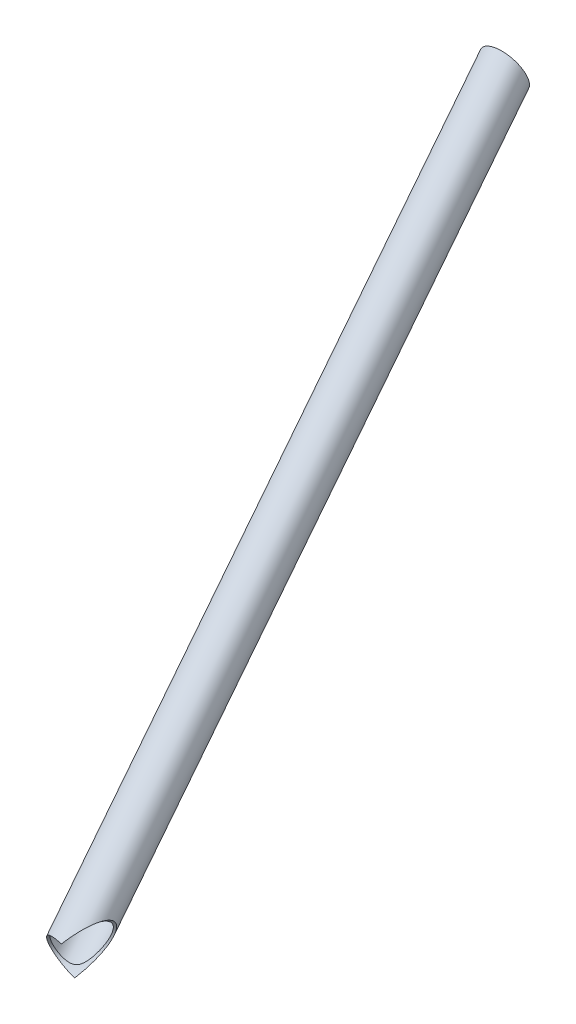
ISO-10303-21;
HEADER;
FILE_DESCRIPTION(('STEP AP214'),'2;1');
FILE_NAME('part.step','',(''),(''),'','','');
FILE_SCHEMA(('AUTOMOTIVE_DESIGN { 1 0 10303 214 1 1 1 1 }'));
ENDSEC;
DATA;
#1=APPLICATION_CONTEXT('core data for automotive mechanical design processes');
#2=APPLICATION_PROTOCOL_DEFINITION('international standard','automotive_design',2000,#1);
#3=PRODUCT_CONTEXT('',#1,'mechanical');
#4=PRODUCT('Part','Part','',(#3));
#5=PRODUCT_RELATED_PRODUCT_CATEGORY('part','',(#4));
#6=PRODUCT_DEFINITION_FORMATION('','',#4);
#7=PRODUCT_DEFINITION_CONTEXT('part definition',#1,'design');
#8=PRODUCT_DEFINITION('design','',#6,#7);
#9=PRODUCT_DEFINITION_SHAPE('','',#8);
#10=(LENGTH_UNIT() NAMED_UNIT(*) SI_UNIT(.MILLI.,.METRE.));
#11=(NAMED_UNIT(*) PLANE_ANGLE_UNIT() SI_UNIT($,.RADIAN.));
#12=(NAMED_UNIT(*) SI_UNIT($,.STERADIAN.) SOLID_ANGLE_UNIT());
#13=UNCERTAINTY_MEASURE_WITH_UNIT(LENGTH_MEASURE(1.E-05),#10,'distance_accuracy_value','');
#14=(GEOMETRIC_REPRESENTATION_CONTEXT(3) GLOBAL_UNCERTAINTY_ASSIGNED_CONTEXT((#13)) GLOBAL_UNIT_ASSIGNED_CONTEXT((#10,
#11,#12)) REPRESENTATION_CONTEXT('',''));
#15=CARTESIAN_POINT('',(0.,0.,0.));
#16=DIRECTION('',(0.,0.,1.));
#17=DIRECTION('',(1.,0.,0.));
#18=AXIS2_PLACEMENT_3D('',#15,#16,#17);
#19=CARTESIAN_POINT('',(80.0000000000001,380.,-601.037933611912));
#20=DIRECTION('',(0.313257210262409,-0.388871019636094,0.866400167535647));
#21=DIRECTION('',(0.,-0.912318699307092,-0.409480879766828));
#22=AXIS2_PLACEMENT_3D('',#19,#20,#21);
#23=CYLINDRICAL_SURFACE('',#22,11.3);
#24=CARTESIAN_POINT('',(80.0000000000001,380.,-601.037933611912));
#25=DIRECTION('',(-0.0877040448988902,0.311824264686693,-0.946083309471727));
#26=DIRECTION('',(0.915766996856784,-0.348518707826595,-0.199763654759287));
#27=AXIS2_PLACEMENT_3D('',#24,#25,#26);
#28=ELLIPSE('',#27,11.6684899557684,11.3);
#29=CARTESIAN_POINT('',(90.6856180046477,375.933312958328,-603.368873810998));
#30=VERTEX_POINT('',#29);
#31=EDGE_CURVE('E81',#30,#30,#28,.T.);
#32=ORIENTED_EDGE('',*,*,#31,.T.);
#33=EDGE_LOOP('',(#32));
#34=FACE_BOUND('',#33,.T.);
#35=CARTESIAN_POINT('',(222.828162374543,192.3868729915,-210.633956516908));
#36=CARTESIAN_POINT('',(222.957115085465,192.469348104641,-210.817715328913));
#37=CARTESIAN_POINT('',(223.079165790472,192.55780120646,-211.003660310366));
#38=CARTESIAN_POINT('',(223.311851727521,192.744301069953,-211.377928118761));
#39=CARTESIAN_POINT('',(223.422479501602,192.842354018944,-211.566252410218));
#40=CARTESIAN_POINT('',(223.634639828135,193.046598409118,-211.944281578601));
#41=CARTESIAN_POINT('',(223.736150399496,193.152808431368,-212.133988659696));
#42=CARTESIAN_POINT('',(223.931531092938,193.371972189239,-212.513342320236));
#43=CARTESIAN_POINT('',(224.025402803244,193.484924514532,-212.70298890405));
#44=CARTESIAN_POINT('',(224.208074460822,193.718229355565,-213.083926226668));
#45=CARTESIAN_POINT('',(224.296797203213,193.838656192305,-213.275208241965));
#46=CARTESIAN_POINT('',(224.4690616336,194.085065562494,-213.656540297822));
#47=CARTESIAN_POINT('',(224.552602799399,194.211048653718,-213.846590212489));
#48=CARTESIAN_POINT('',(224.715302685776,194.468007464896,-214.22477113452));
#49=CARTESIAN_POINT('',(224.794466969055,194.598976472952,-214.412904317574));
#50=CARTESIAN_POINT('',(224.949245790822,194.86581139779,-214.787151159042));
#51=CARTESIAN_POINT('',(225.024860183466,195.001677515359,-214.973264734242));
#52=CARTESIAN_POINT('',(225.220479240454,195.36645873193,-215.46131501484));
#53=CARTESIAN_POINT('',(225.3379808199,195.599365129875,-215.761283745109));
#54=CARTESIAN_POINT('',(225.566872803063,196.077565044939,-216.353618540502));
#55=CARTESIAN_POINT('',(225.678262606299,196.322859774677,-216.645983857113));
#56=CARTESIAN_POINT('',(225.896352843654,196.826217033243,-217.222152753172));
#57=CARTESIAN_POINT('',(226.003046185513,197.084297700232,-217.505943193616));
#58=CARTESIAN_POINT('',(226.212447757731,197.613142273316,-218.062965514165));
#59=CARTESIAN_POINT('',(226.315156251681,197.883905337865,-218.336198092651));
#60=CARTESIAN_POINT('',(226.516072293783,198.43554513086,-218.867387749172));
#61=CARTESIAN_POINT('',(226.614316859343,198.71627831378,-219.125479526924));
#62=CARTESIAN_POINT('',(226.807839957527,199.291258772751,-219.627492140994));
#63=CARTESIAN_POINT('',(226.903117994083,199.585508288868,-219.871410613083));
#64=CARTESIAN_POINT('',(227.090614031368,200.187529510982,-220.341827959793));
#65=CARTESIAN_POINT('',(227.182838108353,200.495271131787,-220.568362773811));
#66=CARTESIAN_POINT('',(227.364312820714,201.125485184233,-221.00106972114));
#67=CARTESIAN_POINT('',(227.453564994347,201.447949783667,-221.207252500749));
#68=CARTESIAN_POINT('',(227.59240102139,201.971260075786,-221.514376695758));
#69=CARTESIAN_POINT('',(227.643076178468,202.167042873658,-221.62348422622));
#70=CARTESIAN_POINT('',(227.743174628546,202.563996443177,-221.832090275745));
#71=CARTESIAN_POINT('',(227.79259795549,202.765167068425,-221.931589055561));
#72=CARTESIAN_POINT('',(227.890093104867,203.173205556742,-222.119804150206));
#73=CARTESIAN_POINT('',(227.938162851778,203.380081298625,-222.208504532946));
#74=CARTESIAN_POINT('',(228.032646786405,203.799157363315,-222.373413030373));
#75=CARTESIAN_POINT('',(228.079060953827,204.011357751338,-222.449620991969));
#76=CARTESIAN_POINT('',(228.170393050868,204.442986634704,-222.588456948029));
#77=CARTESIAN_POINT('',(228.215291019131,204.662466625343,-222.650939299122));
#78=CARTESIAN_POINT('',(228.302695628532,205.10604262979,-222.759237565865));
#79=CARTESIAN_POINT('',(228.345202055775,205.330139054041,-222.805051992769));
#80=CARTESIAN_POINT('',(228.427245507137,205.781548318939,-222.877628333093));
#81=CARTESIAN_POINT('',(228.466787859061,206.008854471164,-222.904425201823));
#82=CARTESIAN_POINT('',(228.542386073738,206.465551910037,-222.936696466794));
#83=CARTESIAN_POINT('',(228.578443403925,206.694942274182,-222.942179875953));
#84=CARTESIAN_POINT('',(228.637207476792,207.091577400588,-222.931315576169));
#85=CARTESIAN_POINT('',(228.660886199806,207.258837639086,-222.920475114301));
#86=CARTESIAN_POINT('',(228.705770072525,207.592294036254,-222.885569932621));
#87=CARTESIAN_POINT('',(228.726975849519,207.75849045462,-222.861508575315));
#88=CARTESIAN_POINT('',(228.76664776383,208.088533197429,-222.799686252957));
#89=CARTESIAN_POINT('',(228.785115902353,208.252381158651,-222.761935365187));
#90=CARTESIAN_POINT('',(228.81910948822,208.576567430454,-222.672531581539));
#91=CARTESIAN_POINT('',(228.834634876882,208.736905670988,-222.62087840848));
#92=CARTESIAN_POINT('',(228.862611504255,209.053186102054,-222.503665097216));
#93=CARTESIAN_POINT('',(228.875054452245,209.209115458565,-222.438068316281));
#94=CARTESIAN_POINT('',(228.89671501867,209.514905953239,-222.293568785907));
#95=CARTESIAN_POINT('',(228.905932702196,209.664767213812,-222.214666305044));
#96=CARTESIAN_POINT('',(228.921129512852,209.957467002677,-222.044348202895));
#97=CARTESIAN_POINT('',(228.927106975646,210.100301887693,-221.952926181096));
#98=CARTESIAN_POINT('',(228.935876407262,210.378104460403,-221.758672752903));
#99=CARTESIAN_POINT('',(228.938667738316,210.513070567872,-221.655839066751));
#100=CARTESIAN_POINT('',(228.941434436757,210.800730338726,-221.41842388673));
#101=CARTESIAN_POINT('',(228.940736542838,210.951585462416,-221.281602412266));
#102=CARTESIAN_POINT('',(228.935222841981,211.240824965297,-220.99550552432));
#103=CARTESIAN_POINT('',(228.930406217106,211.379206861403,-220.846227642441));
#104=CARTESIAN_POINT('',(228.910266265929,211.776075769126,-220.382409693174));
#105=CARTESIAN_POINT('',(228.889251564301,212.016050804719,-220.052085509899));
#106=CARTESIAN_POINT('',(228.841467424049,212.397226190426,-219.447758647526));
#107=CARTESIAN_POINT('',(228.817327425277,212.548269442899,-219.179510887787));
#108=CARTESIAN_POINT('',(228.7629591429,212.826698702412,-218.631426019279));
#109=CARTESIAN_POINT('',(228.732727537127,212.954071727286,-218.351582653078));
#110=CARTESIAN_POINT('',(228.666978381912,213.187622142934,-217.783483544548));
#111=CARTESIAN_POINT('',(228.631454069618,213.293772002965,-217.495217424368));
#112=CARTESIAN_POINT('',(228.555776277607,213.487045129162,-216.912903936573));
#113=CARTESIAN_POINT('',(228.515621097828,213.574161373607,-216.618854478876));
#114=CARTESIAN_POINT('',(228.435234650602,213.723785120244,-216.055354633196));
#115=CARTESIAN_POINT('',(228.395382388081,213.787853843382,-215.786259371189));
#116=CARTESIAN_POINT('',(228.31255561616,213.903368525935,-215.245914886202));
#117=CARTESIAN_POINT('',(228.269581625524,213.954816576444,-214.974666027746));
#118=CARTESIAN_POINT('',(228.180643785828,214.046277203228,-214.430511412922));
#119=CARTESIAN_POINT('',(228.134677479818,214.086280232994,-214.157604466139));
#120=CARTESIAN_POINT('',(228.039883931099,214.155775324659,-213.610938621318));
#121=CARTESIAN_POINT('',(227.991056354418,214.185266156703,-213.337179627373));
#122=CARTESIAN_POINT('',(227.839967985195,214.25946197845,-212.51326998126));
#123=CARTESIAN_POINT('',(227.733438132036,214.289558247075,-211.962548781535));
#124=CARTESIAN_POINT('',(227.508675784083,214.316467769021,-210.863107615511));
#125=CARTESIAN_POINT('',(227.390449358197,214.313298193938,-210.314386762968));
#126=CARTESIAN_POINT('',(227.195895430958,214.285748216704,-209.463215066435));
#127=CARTESIAN_POINT('',(227.124203855783,214.271384452657,-209.159334709659));
#128=CARTESIAN_POINT('',(226.976121341431,214.234224191724,-208.55322122597));
#129=CARTESIAN_POINT('',(226.899730269726,214.211427456932,-208.250988145773));
#130=CARTESIAN_POINT('',(226.741467379053,214.157892343226,-207.648276370183));
#131=CARTESIAN_POINT('',(226.659589059488,214.127144416985,-207.347800231057));
#132=CARTESIAN_POINT('',(226.489474071624,214.05817614594,-206.749525866463));
#133=CARTESIAN_POINT('',(226.401237709518,214.019956160829,-206.451727512811));
#134=CARTESIAN_POINT('',(226.21746205907,213.936614378683,-205.860727370732));
#135=CARTESIAN_POINT('',(226.12195441401,213.891521717519,-205.567511684088));
#136=CARTESIAN_POINT('',(225.921500878887,213.794654468503,-204.985341550358));
#137=CARTESIAN_POINT('',(225.816552963655,213.742878445864,-204.696388033163));
#138=CARTESIAN_POINT('',(225.594986636643,213.633067249416,-204.124859363375));
#139=CARTESIAN_POINT('',(225.478392407054,213.57504502639,-203.842272428241));
#140=CARTESIAN_POINT('',(225.230039873068,213.452945479366,-203.285256186545));
#141=CARTESIAN_POINT('',(225.098290431618,213.388871698275,-203.010822229005));
#142=CARTESIAN_POINT('',(224.857051642309,213.274748811377,-202.553336574914));
#143=CARTESIAN_POINT('',(224.752537362484,213.226171168683,-202.367306944988));
#144=CARTESIAN_POINT('',(224.531795901709,213.126190585119,-202.002989643803));
#145=CARTESIAN_POINT('',(224.415566669266,213.074787150122,-201.824703336382));
#146=CARTESIAN_POINT('',(224.170049738163,212.969523939696,-201.479495396576));
#147=CARTESIAN_POINT('',(224.040832490761,212.915678202373,-201.312519886216));
#148=CARTESIAN_POINT('',(223.767155920065,212.805402113939,-200.992473801607));
#149=CARTESIAN_POINT('',(223.622706046546,212.748973377383,-200.839394714937));
#150=CARTESIAN_POINT('',(223.361690804148,212.650222788303,-200.59261216782));
#151=CARTESIAN_POINT('',(223.249058899831,212.608512909695,-200.494496651084));
#152=CARTESIAN_POINT('',(223.015913235714,212.523845471911,-200.308751256822));
#153=CARTESIAN_POINT('',(222.89540182943,212.480888287402,-200.221118270215));
#154=CARTESIAN_POINT('',(222.647151220518,212.393696947322,-200.05744183412));
#155=CARTESIAN_POINT('',(222.519410996207,212.34946261168,-199.981400028508));
#156=CARTESIAN_POINT('',(222.2578374084,212.259648010314,-199.841571107846));
#157=CARTESIAN_POINT('',(222.124003663866,212.214067660484,-199.777784760455));
#158=CARTESIAN_POINT('',(221.852301151062,212.121650145601,-199.662831055019));
#159=CARTESIAN_POINT('',(221.714455049264,212.074820131861,-199.611604111197));
#160=CARTESIAN_POINT('',(221.43553000543,211.979493797339,-199.520926158217));
#161=CARTESIAN_POINT('',(221.294451010229,211.930997449147,-199.48147534287));
#162=CARTESIAN_POINT('',(221.010128886044,211.832012980756,-199.413482320394));
#163=CARTESIAN_POINT('',(220.866882589301,211.781521726611,-199.384958096683));
#164=CARTESIAN_POINT('',(220.579523874214,211.678348060864,-199.337896585219));
#165=CARTESIAN_POINT('',(220.435411195091,211.62566495803,-199.319362474101));
#166=CARTESIAN_POINT('',(220.045902144728,211.479923250535,-199.281332048896));
#167=CARTESIAN_POINT('',(219.800536215081,211.384520820705,-199.270321777919));
#168=CARTESIAN_POINT('',(219.313141686863,211.18538297168,-199.269351176061));
#169=CARTESIAN_POINT('',(219.071115416057,211.081642053387,-199.279404847873));
#170=CARTESIAN_POINT('',(218.592198705662,210.864719314619,-199.316639501949));
#171=CARTESIAN_POINT('',(218.35531812123,210.751521098927,-199.343850786573));
#172=CARTESIAN_POINT('',(217.888764146317,210.515160909383,-199.412321727021));
#173=CARTESIAN_POINT('',(217.659089347964,210.392000898913,-199.453578619699));
#174=CARTESIAN_POINT('',(217.194564580606,210.127455345888,-199.550592030785));
#175=CARTESIAN_POINT('',(216.960236683502,209.985418772198,-199.607072446696));
#176=CARTESIAN_POINT('',(216.502388725735,209.68919480096,-199.730936551511));
#177=CARTESIAN_POINT('',(216.278869129917,209.535006881554,-199.798320708825));
#178=CARTESIAN_POINT('',(215.844032748469,209.214409404144,-199.942215191488));
#179=CARTESIAN_POINT('',(215.632709914995,209.048005997903,-200.018720935127));
#180=CARTESIAN_POINT('',(215.223414672442,208.702956959346,-200.179456315883));
#181=CARTESIAN_POINT('',(215.025442666181,208.524310957978,-200.263686185869));
#182=CARTESIAN_POINT('',(214.60519082701,208.117296209456,-200.45650996467));
#183=CARTESIAN_POINT('',(214.386189821457,207.886218070502,-200.56656903596));
#184=CARTESIAN_POINT('',(213.971557547005,207.407351782371,-200.794252481235));
#185=CARTESIAN_POINT('',(213.77592939128,207.159561414052,-200.911877859821));
#186=CARTESIAN_POINT('',(213.410173765544,206.648388820891,-201.153003492048));
#187=CARTESIAN_POINT('',(213.240051134273,206.385003650694,-201.276504854601));
#188=CARTESIAN_POINT('',(212.927389752974,205.844256962171,-201.527734802786));
#189=CARTESIAN_POINT('',(212.784848115303,205.566896910808,-201.655462944244));
#190=CARTESIAN_POINT('',(212.537255302474,205.018134844474,-201.905396329635));
#191=CARTESIAN_POINT('',(212.430398861319,204.747471951603,-202.027437584844));
#192=CARTESIAN_POINT('',(212.243677316163,204.197468071203,-202.272628337511));
#193=CARTESIAN_POINT('',(212.163811340054,203.918127364389,-202.395777799029));
#194=CARTESIAN_POINT('',(212.03203499395,203.353023716534,-202.64193716179));
#195=CARTESIAN_POINT('',(211.980111786946,203.067263787472,-202.764947101167));
#196=CARTESIAN_POINT('',(211.904747599718,202.491509536337,-203.009763471039));
#197=CARTESIAN_POINT('',(211.881305280431,202.201515413988,-203.131569957849));
#198=CARTESIAN_POINT('',(211.863713770437,201.639568656813,-203.36472500218));
#199=CARTESIAN_POINT('',(211.867676303682,201.367734029621,-203.476220352349));
#200=CARTESIAN_POINT('',(211.900346505942,200.824493484704,-203.696558172516));
#201=CARTESIAN_POINT('',(211.929052816826,200.55308754427,-203.805400787781));
#202=CARTESIAN_POINT('',(212.010781727579,200.012692623603,-204.019824850659));
#203=CARTESIAN_POINT('',(212.063802574909,199.743703470599,-204.125406532729));
#204=CARTESIAN_POINT('',(212.193482615415,199.210029417325,-204.332854923992));
#205=CARTESIAN_POINT('',(212.270142332948,198.94534461267,-204.434721550721));
#206=CARTESIAN_POINT('',(212.446688007463,198.420677569835,-204.634972641106));
#207=CARTESIAN_POINT('',(212.546698325526,198.160728841101,-204.733335089985));
#208=CARTESIAN_POINT('',(212.768633097341,197.648763526946,-204.925848428207));
#209=CARTESIAN_POINT('',(212.890557550935,197.396746941468,-205.01999931758));
#210=CARTESIAN_POINT('',(213.155156495421,196.902181713327,-205.204170415208));
#211=CARTESIAN_POINT('',(213.297837432451,196.659636041743,-205.29418932877));
#212=CARTESIAN_POINT('',(213.60263108388,196.18560312065,-205.470331900742));
#213=CARTESIAN_POINT('',(213.764744282788,195.954116147071,-205.556455461954));
#214=CARTESIAN_POINT('',(214.119292550475,195.487546830643,-205.731345441645));
#215=CARTESIAN_POINT('',(214.313065983173,195.253387187902,-205.819861735684));
#216=CARTESIAN_POINT('',(214.719736453618,194.801111161517,-205.994015132273));
#217=CARTESIAN_POINT('',(214.932636080813,194.582996957518,-206.0796518428));
#218=CARTESIAN_POINT('',(215.375934495602,194.164548074818,-206.24957062089));
#219=CARTESIAN_POINT('',(215.606341114456,193.964221440812,-206.333852061542));
#220=CARTESIAN_POINT('',(216.082770121012,193.583507739662,-206.503158614663));
#221=CARTESIAN_POINT('',(216.328788368005,193.403115419803,-206.588183524824));
#222=CARTESIAN_POINT('',(216.768279468552,193.109016165019,-206.739317251732));
#223=CARTESIAN_POINT('',(216.958655053912,192.990211945718,-206.804553528916));
#224=CARTESIAN_POINT('',(217.34592703238,192.766039276934,-206.938819897079));
#225=CARTESIAN_POINT('',(217.54282367156,192.660671335198,-207.007850131287));
#226=CARTESIAN_POINT('',(217.941555526437,192.465101309238,-207.151686956949));
#227=CARTESIAN_POINT('',(218.143381953695,192.374874213359,-207.226483718072));
#228=CARTESIAN_POINT('',(218.550551262201,192.211315337256,-207.384530885314));
#229=CARTESIAN_POINT('',(218.755892639311,192.137976515134,-207.467777747061));
#230=CARTESIAN_POINT('',(219.105281401356,192.029746763649,-207.618751607135));
#231=CARTESIAN_POINT('',(219.249072607092,191.989937022514,-207.683551552996));
#232=CARTESIAN_POINT('',(219.535980014819,191.920441535628,-207.819701936611));
#233=CARTESIAN_POINT('',(219.679096432234,191.890752307741,-207.891050110587));
#234=CARTESIAN_POINT('',(219.962996874193,191.842274234534,-208.041028955079));
#235=CARTESIAN_POINT('',(220.103785077559,191.823463175221,-208.11964440157));
#236=CARTESIAN_POINT('',(220.381719497291,191.797174575359,-208.284839144119));
#237=CARTESIAN_POINT('',(220.518865943899,191.789696316633,-208.371417935159));
#238=CARTESIAN_POINT('',(220.788732730518,191.786220006486,-208.553208270601));
#239=CARTESIAN_POINT('',(220.921419980407,191.790294129766,-208.648470473367));
#240=CARTESIAN_POINT('',(221.180022294998,191.809757914638,-208.84671913367));
#241=CARTESIAN_POINT('',(221.305936993581,191.825148187314,-208.949706008077));
#242=CARTESIAN_POINT('',(221.550182964906,191.866489016775,-209.162638107929));
#243=CARTESIAN_POINT('',(221.66850357238,191.892454064854,-209.272592706396));
#244=CARTESIAN_POINT('',(221.896963757726,191.953832021735,-209.498137829612));
#245=CARTESIAN_POINT('',(222.007103830182,191.989244358771,-209.613728012941));
#246=CARTESIAN_POINT('',(222.244013302867,192.077477694402,-209.876719054974));
#247=CARTESIAN_POINT('',(222.368706180599,192.132431647482,-210.025274444944));
#248=CARTESIAN_POINT('',(222.547175589492,192.222504219857,-210.251410778554));
#249=CARTESIAN_POINT('',(222.605187063916,192.253769381294,-210.327267976857));
#250=CARTESIAN_POINT('',(222.718592551762,192.318628987427,-210.479940336338));
#251=CARTESIAN_POINT('',(222.773986572244,192.35222342584,-210.55675549493));
#252=CARTESIAN_POINT('',(222.828162374543,192.3868729915,-210.633956516908));
#253=B_SPLINE_CURVE_WITH_KNOTS('',3,(#35,#36,#37,#38,#39,#40,#41,#42,#43,#44,#45,#46,#47,#48,
#49,#50,#51,#52,#53,#54,#55,#56,#57,#58,#59,#60,#61,#62,#63,#64,#65,#66,#67,#68,#69,#70,#71,#72,
#73,#74,#75,#76,#77,#78,#79,#80,#81,#82,#83,#84,#85,#86,#87,#88,#89,#90,#91,#92,#93,#94,#95,#96,
#97,#98,#99,#100,#101,#102,#103,#104,#105,#106,#107,#108,#109,#110,#111,#112,#113,#114,#115,
#116,#117,#118,#119,#120,#121,#122,#123,#124,#125,#126,#127,#128,#129,#130,#131,#132,#133,#134,
#135,#136,#137,#138,#139,#140,#141,#142,#143,#144,#145,#146,#147,#148,#149,#150,#151,#152,#153,
#154,#155,#156,#157,#158,#159,#160,#161,#162,#163,#164,#165,#166,#167,#168,#169,#170,#171,#172,
#173,#174,#175,#176,#177,#178,#179,#180,#181,#182,#183,#184,#185,#186,#187,#188,#189,#190,#191,
#192,#193,#194,#195,#196,#197,#198,#199,#200,#201,#202,#203,#204,#205,#206,#207,#208,#209,#210,
#211,#212,#213,#214,#215,#216,#217,#218,#219,#220,#221,#222,#223,#224,#225,#226,#227,#228,#229,
#230,#231,#232,#233,#234,#235,#236,#237,#238,#239,#240,#241,#242,#243,#244,#245,#246,#247,#248,
#249,#250,#251,#252),.UNSPECIFIED.,.T.,.F.,(4,2,2,2,2,2,2,2,2,2,2,2,2,2,2,2,2,2,2,2,2,2,2,2,2,2,
2,2,2,2,2,2,2,2,2,2,2,2,2,2,2,2,2,2,2,2,2,2,2,2,2,2,2,2,2,2,2,2,2,2,2,2,2,2,2,2,2,2,2,2,2,2,2,2,
2,2,2,2,2,2,2,2,2,2,2,2,2,2,2,2,2,2,2,2,2,2,2,2,2,2,2,2,2,2,2,2,2,2,4),(0.,0.717419264570185,
1.43530400477421,2.15487550371246,2.87429700958335,3.60262780010119,4.33103187239829,
5.05848784619075,5.7859736806243,6.97823277318627,8.17060879594598,9.36472767099925,
10.5587674217808,11.7397074587129,12.9208439244434,14.0994687307997,15.2774736857481,
15.9666204965787,16.6557486007641,17.3458814378181,18.0360227316773,18.7331669326311,
19.430373385872,20.1262949931001,20.8219222807473,21.3292661504084,21.8364810455539,
22.3433233197633,22.8501757000607,23.3583768907388,23.8665678245872,24.3750195435863,
24.8835730216625,25.4936322059838,26.103812569751,27.3250881640451,28.2503484015392,
29.1761146188562,30.1030740601545,31.030374892273,31.8684608759167,32.706407904976,
33.5450518573164,34.3837938931096,36.0676089678524,37.750554911793,38.6880808194476,
39.6256331781452,40.56431656503,41.5029547763376,42.4377190813621,43.3726843967627,
44.3057472032325,45.2382670913513,45.8944151169727,46.5506782458504,47.2035562123391,
47.8560315132522,48.3207951731646,48.7854206421896,49.2501119438186,49.7148323434269,
50.1773033374501,50.6397819423311,51.1030184755915,51.56640222108,52.3555954609523,
53.1453134998697,53.9364301953403,54.7273913468608,55.5660129012526,56.4046704912342,
57.2429085900752,58.0811719686962,59.0904235718089,60.0998094538652,61.1093865883124,
62.1188579659581,63.0642599176207,64.0096313187568,64.9545680413425,65.8994603349225,
66.7799283348253,67.6603480108776,68.5407042381656,69.4210799949223,70.306255964489,
71.1914319276638,72.0768833804256,72.9623569149985,73.9110321610716,74.8598360400372,
75.8090668670379,76.7580469711146,77.4586867881201,78.1593530739351,78.8588502623415,
79.5580552513826,80.0456664161154,80.5331096400704,81.0195539229528,81.5059673778176,
81.99542643439,82.484911924212,82.9750704565718,83.4651993304078,84.0691282870682,
84.3705323351537,84.6719355702276),.UNSPECIFIED.);
#254=CARTESIAN_POINT('',(222.828162374543,192.3868729915,-210.633956516908));
#255=VERTEX_POINT('',#254);
#256=EDGE_CURVE('E46',#255,#255,#253,.T.);
#257=ORIENTED_EDGE('',*,*,#256,.T.);
#258=EDGE_LOOP('',(#257));
#259=FACE_BOUND('',#258,.T.);
#260=ADVANCED_FACE('F41',(#34,#259),#23,.F.);
#261=CARTESIAN_POINT('',(80.0000000000001,380.,-601.037933611912));
#262=DIRECTION('',(0.313257210262409,-0.388871019636094,0.866400167535647));
#263=DIRECTION('',(0.,-0.912318699307092,-0.409480879766828));
#264=AXIS2_PLACEMENT_3D('',#261,#262,#263);
#265=CYLINDRICAL_SURFACE('',#264,12.5);
#266=CARTESIAN_POINT('',(80.0000000000001,380.,-601.037933611912));
#267=DIRECTION('',(-0.0877040448988902,0.311824264686693,-0.946083309471727));
#268=DIRECTION('',(0.915766996856784,-0.348518707826595,-0.199763654759287));
#269=AXIS2_PLACEMENT_3D('',#266,#267,#268);
#270=ELLIPSE('',#269,12.9076216324872,12.5);
#271=CARTESIAN_POINT('',(91.8203738989466,375.501452387531,-603.616407283468));
#272=VERTEX_POINT('',#271);
#273=EDGE_CURVE('E63',#272,#272,#270,.T.);
#274=ORIENTED_EDGE('',*,*,#273,.F.);
#275=EDGE_LOOP('',(#274));
#276=FACE_BOUND('',#275,.T.);
#277=CARTESIAN_POINT('',(225.,200.,-200.));
#278=DIRECTION('',(0.979997411230481,-0.1383871597552,0.143017719169493));
#279=DIRECTION('',(-0.18494238420669,-0.367901037751926,0.911287627999525));
#280=AXIS2_PLACEMENT_3D('',#277,#278,#279);
#281=ELLIPSE('',#280,25.7882654286992,12.5);
#282=CARTESIAN_POINT('',(224.081323259256,188.506130571339,-204.826696448183));
#283=VERTEX_POINT('',#282);
#284=CARTESIAN_POINT('',(225.918676740744,211.493869428661,-195.173303551817));
#285=VERTEX_POINT('',#284);
#286=EDGE_CURVE('E56',#283,#285,#281,.T.);
#287=ORIENTED_EDGE('',*,*,#286,.F.);
#288=CARTESIAN_POINT('',(225.,200.,-200.));
#289=DIRECTION('',(-0.18494238420669,-0.367901037751926,0.911287627999525));
#290=DIRECTION('',(0.979997411230481,-0.1383871597552,0.143017719169493));
#291=AXIS2_PLACEMENT_3D('',#288,#289,#290);
#292=ELLIPSE('',#291,14.291083324664,12.5);
#293=EDGE_CURVE('E11',#285,#283,#292,.T.);
#294=ORIENTED_EDGE('',*,*,#293,.F.);
#295=EDGE_LOOP('',(#287,#294));
#296=FACE_BOUND('',#295,.T.);
#297=ADVANCED_FACE('F65',(#276,#296),#265,.T.);
#298=CARTESIAN_POINT('',(80.,380.,-601.037933611912));
#299=DIRECTION('',(-0.0877040448988902,0.311824264686693,-0.946083309471727));
#300=DIRECTION('',(0.,0.949743072396233,0.313030504001389));
#301=AXIS2_PLACEMENT_3D('',#298,#299,#300);
#302=PLANE('',#301);
#303=ORIENTED_EDGE('',*,*,#31,.F.);
#304=EDGE_LOOP('',(#303));
#305=FACE_BOUND('',#304,.T.);
#306=ORIENTED_EDGE('',*,*,#273,.T.);
#307=EDGE_LOOP('',(#306));
#308=FACE_BOUND('',#307,.T.);
#309=ADVANCED_FACE('F67',(#305,#308),#302,.T.);
#310=CARTESIAN_POINT('',(50.0000000000001,130.,-1.11022302462516E-13));
#311=DIRECTION('',(0.636784790371593,0.254713916148637,-0.727754046138963));
#312=DIRECTION('',(-0.752576694706878,0.,-0.658504607868518));
#313=AXIS2_PLACEMENT_3D('',#310,#311,#312);
#314=CYLINDRICAL_SURFACE('',#313,12.5);
#315=ORIENTED_EDGE('',*,*,#256,.F.);
#316=EDGE_LOOP('',(#315));
#317=FACE_BOUND('',#316,.T.);
#318=ORIENTED_EDGE('',*,*,#286,.T.);
#319=ORIENTED_EDGE('',*,*,#293,.T.);
#320=EDGE_LOOP('',(#318,#319));
#321=FACE_BOUND('',#320,.T.);
#322=ADVANCED_FACE('F43',(#317,#321),#314,.F.);
#323=CLOSED_SHELL('',(#260,#297,#309,#322));
#324=MANIFOLD_SOLID_BREP('B2',#323);
#325=ADVANCED_BREP_SHAPE_REPRESENTATION('',(#18,#324),#14);
#326=SHAPE_DEFINITION_REPRESENTATION(#9,#325);
ENDSEC;
END-ISO-10303-21;
